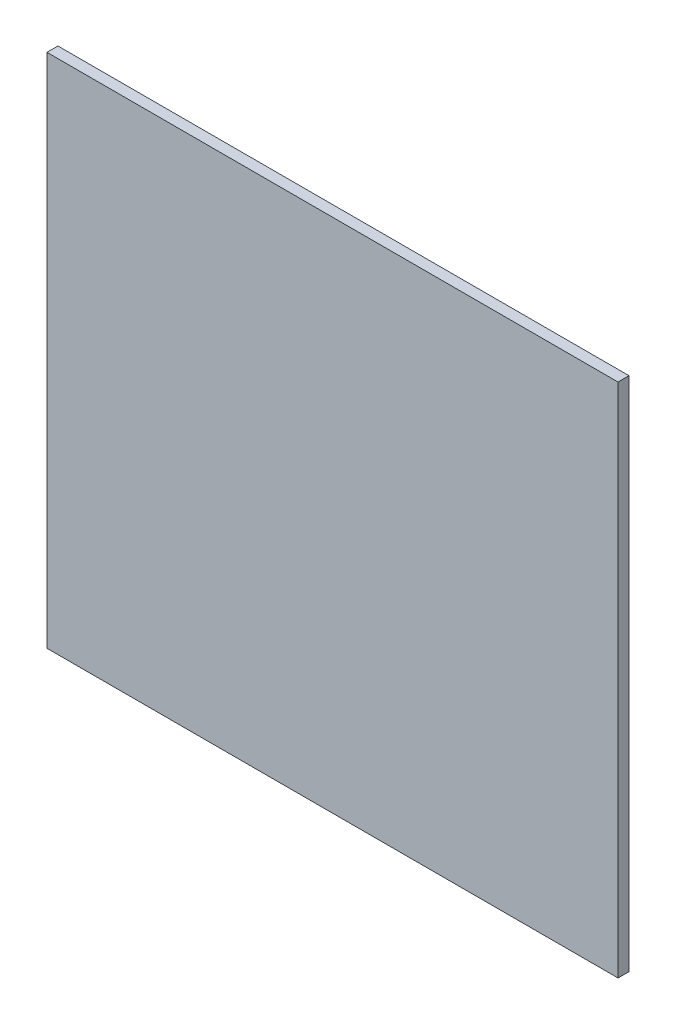
ISO-10303-21;
HEADER;
FILE_DESCRIPTION(('STEP AP214'),'2;1');
FILE_NAME('part.step','',(''),(''),'','','');
FILE_SCHEMA(('AUTOMOTIVE_DESIGN { 1 0 10303 214 1 1 1 1 }'));
ENDSEC;
DATA;
#1=APPLICATION_CONTEXT('core data for automotive mechanical design processes');
#2=APPLICATION_PROTOCOL_DEFINITION('international standard','automotive_design',2000,#1);
#3=PRODUCT_CONTEXT('',#1,'mechanical');
#4=PRODUCT('Part','Part','',(#3));
#5=PRODUCT_RELATED_PRODUCT_CATEGORY('part','',(#4));
#6=PRODUCT_DEFINITION_FORMATION('','',#4);
#7=PRODUCT_DEFINITION_CONTEXT('part definition',#1,'design');
#8=PRODUCT_DEFINITION('design','',#6,#7);
#9=PRODUCT_DEFINITION_SHAPE('','',#8);
#10=(LENGTH_UNIT() NAMED_UNIT(*) SI_UNIT(.MILLI.,.METRE.));
#11=(NAMED_UNIT(*) PLANE_ANGLE_UNIT() SI_UNIT($,.RADIAN.));
#12=(NAMED_UNIT(*) SI_UNIT($,.STERADIAN.) SOLID_ANGLE_UNIT());
#13=UNCERTAINTY_MEASURE_WITH_UNIT(LENGTH_MEASURE(1.E-05),#10,'distance_accuracy_value','');
#14=(GEOMETRIC_REPRESENTATION_CONTEXT(3) GLOBAL_UNCERTAINTY_ASSIGNED_CONTEXT((#13)) GLOBAL_UNIT_ASSIGNED_CONTEXT((#10,
#11,#12)) REPRESENTATION_CONTEXT('',''));
#15=CARTESIAN_POINT('',(0.,0.,0.));
#16=DIRECTION('',(0.,0.,1.));
#17=DIRECTION('',(1.,0.,0.));
#18=AXIS2_PLACEMENT_3D('',#15,#16,#17);
#19=CARTESIAN_POINT('',(0.,0.,5.));
#20=DIRECTION('',(-1.,0.,0.));
#21=DIRECTION('',(0.,0.,1.));
#22=AXIS2_PLACEMENT_3D('',#19,#20,#21);
#23=PLANE('',#22);
#24=DIRECTION('',(0.,1.,0.));
#25=VECTOR('',#24,1.);
#26=CARTESIAN_POINT('',(0.,0.,0.));
#27=LINE('',#26,#25);
#28=CARTESIAN_POINT('',(0.,-235.,0.));
#29=VERTEX_POINT('',#28);
#30=CARTESIAN_POINT('',(0.,0.,0.));
#31=VERTEX_POINT('',#30);
#32=EDGE_CURVE('E96',#29,#31,#27,.T.);
#33=ORIENTED_EDGE('',*,*,#32,.T.);
#34=DIRECTION('',(0.,0.,-1.));
#35=VECTOR('',#34,1.);
#36=CARTESIAN_POINT('',(0.,0.,5.));
#37=LINE('',#36,#35);
#38=CARTESIAN_POINT('',(0.,0.,5.));
#39=VERTEX_POINT('',#38);
#40=EDGE_CURVE('E11',#39,#31,#37,.T.);
#41=ORIENTED_EDGE('',*,*,#40,.F.);
#42=DIRECTION('',(0.,1.,0.));
#43=VECTOR('',#42,1.);
#44=CARTESIAN_POINT('',(0.,0.,5.));
#45=LINE('',#44,#43);
#46=CARTESIAN_POINT('',(0.,-235.,5.));
#47=VERTEX_POINT('',#46);
#48=EDGE_CURVE('E84',#47,#39,#45,.T.);
#49=ORIENTED_EDGE('',*,*,#48,.F.);
#50=DIRECTION('',(0.,0.,-1.));
#51=VECTOR('',#50,1.);
#52=CARTESIAN_POINT('',(0.,-235.,5.));
#53=LINE('',#52,#51);
#54=EDGE_CURVE('E92',#47,#29,#53,.T.);
#55=ORIENTED_EDGE('',*,*,#54,.T.);
#56=EDGE_LOOP('',(#33,#41,#49,#55));
#57=FACE_BOUND('',#56,.T.);
#58=ADVANCED_FACE('F33',(#57),#23,.F.);
#59=CARTESIAN_POINT('',(0.,0.,5.));
#60=DIRECTION('',(0.,-1.,0.));
#61=DIRECTION('',(0.,0.,-1.));
#62=AXIS2_PLACEMENT_3D('',#59,#60,#61);
#63=PLANE('',#62);
#64=DIRECTION('',(-1.,0.,0.));
#65=VECTOR('',#64,1.);
#66=CARTESIAN_POINT('',(0.,0.,0.));
#67=LINE('',#66,#65);
#68=CARTESIAN_POINT('',(-260.,0.,0.));
#69=VERTEX_POINT('',#68);
#70=EDGE_CURVE('E88',#31,#69,#67,.T.);
#71=ORIENTED_EDGE('',*,*,#70,.T.);
#72=DIRECTION('',(0.,0.,-1.));
#73=VECTOR('',#72,1.);
#74=CARTESIAN_POINT('',(-260.,0.,5.));
#75=LINE('',#74,#73);
#76=CARTESIAN_POINT('',(-260.,0.,5.));
#77=VERTEX_POINT('',#76);
#78=EDGE_CURVE('E41',#77,#69,#75,.T.);
#79=ORIENTED_EDGE('',*,*,#78,.F.);
#80=DIRECTION('',(-1.,0.,0.));
#81=VECTOR('',#80,1.);
#82=CARTESIAN_POINT('',(0.,0.,5.));
#83=LINE('',#82,#81);
#84=EDGE_CURVE('E79',#39,#77,#83,.T.);
#85=ORIENTED_EDGE('',*,*,#84,.F.);
#86=ORIENTED_EDGE('',*,*,#40,.T.);
#87=EDGE_LOOP('',(#71,#79,#85,#86));
#88=FACE_BOUND('',#87,.T.);
#89=ADVANCED_FACE('F87',(#88),#63,.F.);
#90=CARTESIAN_POINT('',(-260.,0.,5.));
#91=DIRECTION('',(1.,0.,0.));
#92=DIRECTION('',(0.,0.,-1.));
#93=AXIS2_PLACEMENT_3D('',#90,#91,#92);
#94=PLANE('',#93);
#95=DIRECTION('',(0.,-1.,0.));
#96=VECTOR('',#95,1.);
#97=CARTESIAN_POINT('',(-260.,0.,0.));
#98=LINE('',#97,#96);
#99=CARTESIAN_POINT('',(-260.,-235.,0.));
#100=VERTEX_POINT('',#99);
#101=EDGE_CURVE('E66',#69,#100,#98,.T.);
#102=ORIENTED_EDGE('',*,*,#101,.T.);
#103=DIRECTION('',(0.,0.,-1.));
#104=VECTOR('',#103,1.);
#105=CARTESIAN_POINT('',(-260.,-235.,5.));
#106=LINE('',#105,#104);
#107=CARTESIAN_POINT('',(-260.,-235.,5.));
#108=VERTEX_POINT('',#107);
#109=EDGE_CURVE('E89',#108,#100,#106,.T.);
#110=ORIENTED_EDGE('',*,*,#109,.F.);
#111=DIRECTION('',(0.,-1.,0.));
#112=VECTOR('',#111,1.);
#113=CARTESIAN_POINT('',(-260.,0.,5.));
#114=LINE('',#113,#112);
#115=EDGE_CURVE('E82',#77,#108,#114,.T.);
#116=ORIENTED_EDGE('',*,*,#115,.F.);
#117=ORIENTED_EDGE('',*,*,#78,.T.);
#118=EDGE_LOOP('',(#102,#110,#116,#117));
#119=FACE_BOUND('',#118,.T.);
#120=ADVANCED_FACE('F90',(#119),#94,.F.);
#121=CARTESIAN_POINT('',(0.,-235.,5.));
#122=DIRECTION('',(0.,1.,0.));
#123=DIRECTION('',(0.,0.,1.));
#124=AXIS2_PLACEMENT_3D('',#121,#122,#123);
#125=PLANE('',#124);
#126=DIRECTION('',(1.,0.,0.));
#127=VECTOR('',#126,1.);
#128=CARTESIAN_POINT('',(0.,-235.,0.));
#129=LINE('',#128,#127);
#130=EDGE_CURVE('E72',#100,#29,#129,.T.);
#131=ORIENTED_EDGE('',*,*,#130,.T.);
#132=ORIENTED_EDGE('',*,*,#54,.F.);
#133=DIRECTION('',(1.,0.,0.));
#134=VECTOR('',#133,1.);
#135=CARTESIAN_POINT('',(0.,-235.,5.));
#136=LINE('',#135,#134);
#137=EDGE_CURVE('E49',#108,#47,#136,.T.);
#138=ORIENTED_EDGE('',*,*,#137,.F.);
#139=ORIENTED_EDGE('',*,*,#109,.T.);
#140=EDGE_LOOP('',(#131,#132,#138,#139));
#141=FACE_BOUND('',#140,.T.);
#142=ADVANCED_FACE('F103',(#141),#125,.F.);
#143=CARTESIAN_POINT('',(0.,0.,5.));
#144=DIRECTION('',(0.,0.,-1.));
#145=DIRECTION('',(-1.,0.,0.));
#146=AXIS2_PLACEMENT_3D('',#143,#144,#145);
#147=PLANE('',#146);
#148=ORIENTED_EDGE('',*,*,#48,.T.);
#149=ORIENTED_EDGE('',*,*,#84,.T.);
#150=ORIENTED_EDGE('',*,*,#115,.T.);
#151=ORIENTED_EDGE('',*,*,#137,.T.);
#152=EDGE_LOOP('',(#148,#149,#150,#151));
#153=FACE_BOUND('',#152,.T.);
#154=ADVANCED_FACE('F80',(#153),#147,.F.);
#155=CARTESIAN_POINT('',(0.,0.,0.));
#156=DIRECTION('',(0.,0.,-1.));
#157=DIRECTION('',(-1.,0.,0.));
#158=AXIS2_PLACEMENT_3D('',#155,#156,#157);
#159=PLANE('',#158);
#160=ORIENTED_EDGE('',*,*,#32,.F.);
#161=ORIENTED_EDGE('',*,*,#130,.F.);
#162=ORIENTED_EDGE('',*,*,#101,.F.);
#163=ORIENTED_EDGE('',*,*,#70,.F.);
#164=EDGE_LOOP('',(#160,#161,#162,#163));
#165=FACE_BOUND('',#164,.T.);
#166=ADVANCED_FACE('F106',(#165),#159,.T.);
#167=CLOSED_SHELL('',(#58,#89,#120,#142,#154,#166));
#168=MANIFOLD_SOLID_BREP('B2',#167);
#169=ADVANCED_BREP_SHAPE_REPRESENTATION('',(#18,#168),#14);
#170=SHAPE_DEFINITION_REPRESENTATION(#9,#169);
ENDSEC;
END-ISO-10303-21;
